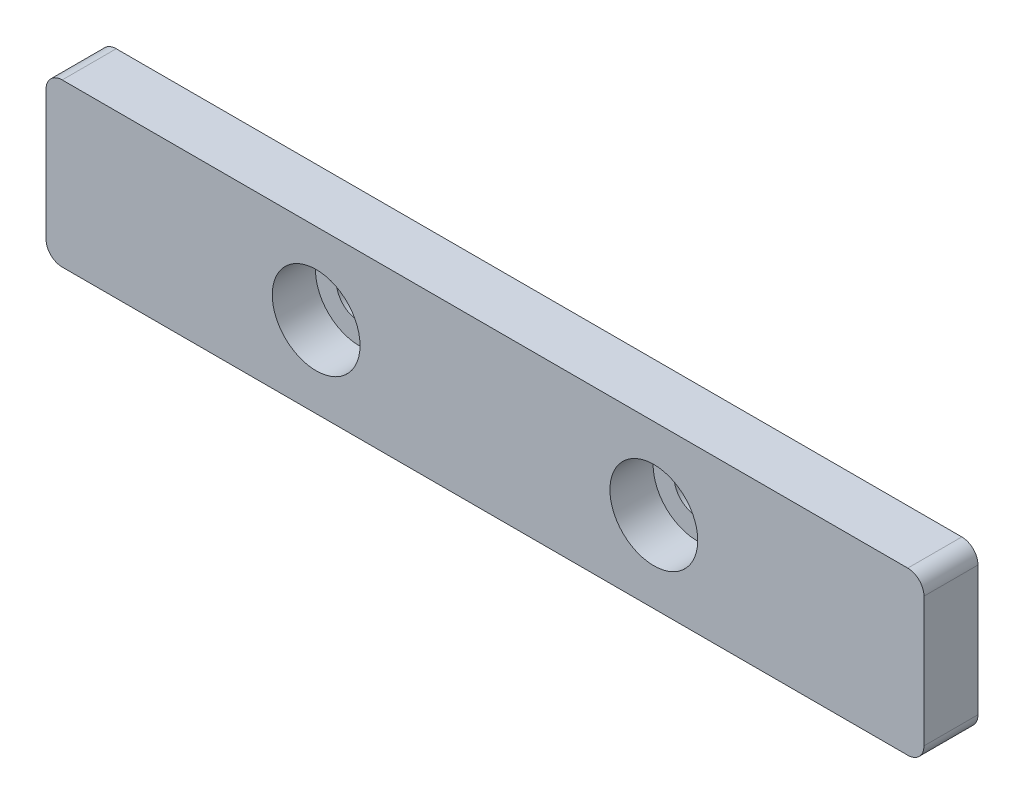
ISO-10303-21;
HEADER;
FILE_DESCRIPTION(('STEP AP214'),'2;1');
FILE_NAME('part.step','',(''),(''),'','','');
FILE_SCHEMA(('AUTOMOTIVE_DESIGN { 1 0 10303 214 1 1 1 1 }'));
ENDSEC;
DATA;
#1=APPLICATION_CONTEXT('core data for automotive mechanical design processes');
#2=APPLICATION_PROTOCOL_DEFINITION('international standard','automotive_design',2000,#1);
#3=PRODUCT_CONTEXT('',#1,'mechanical');
#4=PRODUCT('Part','Part','',(#3));
#5=PRODUCT_RELATED_PRODUCT_CATEGORY('part','',(#4));
#6=PRODUCT_DEFINITION_FORMATION('','',#4);
#7=PRODUCT_DEFINITION_CONTEXT('part definition',#1,'design');
#8=PRODUCT_DEFINITION('design','',#6,#7);
#9=PRODUCT_DEFINITION_SHAPE('','',#8);
#10=(LENGTH_UNIT() NAMED_UNIT(*) SI_UNIT(.MILLI.,.METRE.));
#11=(NAMED_UNIT(*) PLANE_ANGLE_UNIT() SI_UNIT($,.RADIAN.));
#12=(NAMED_UNIT(*) SI_UNIT($,.STERADIAN.) SOLID_ANGLE_UNIT());
#13=UNCERTAINTY_MEASURE_WITH_UNIT(LENGTH_MEASURE(1.E-05),#10,'distance_accuracy_value','');
#14=(GEOMETRIC_REPRESENTATION_CONTEXT(3) GLOBAL_UNCERTAINTY_ASSIGNED_CONTEXT((#13)) GLOBAL_UNIT_ASSIGNED_CONTEXT((#10,
#11,#12)) REPRESENTATION_CONTEXT('',''));
#15=CARTESIAN_POINT('',(0.,0.,0.));
#16=DIRECTION('',(0.,0.,1.));
#17=DIRECTION('',(1.,0.,0.));
#18=AXIS2_PLACEMENT_3D('',#15,#16,#17);
#19=CARTESIAN_POINT('',(46.7897452283095,11.8176884994758,18.));
#20=DIRECTION('',(0.,0.,1.));
#21=DIRECTION('',(1.,0.,0.));
#22=AXIS2_PLACEMENT_3D('',#19,#20,#21);
#23=CYLINDRICAL_SURFACE('',#22,1.7);
#24=CARTESIAN_POINT('',(46.7897452283095,11.8176884994758,18.));
#25=DIRECTION('',(0.,0.,1.));
#26=DIRECTION('',(1.,0.,0.));
#27=AXIS2_PLACEMENT_3D('',#24,#25,#26);
#28=CIRCLE('',#27,1.7);
#29=CARTESIAN_POINT('',(48.4897452283095,11.8176884994758,18.));
#30=VERTEX_POINT('',#29);
#31=EDGE_CURVE('E147',#30,#30,#28,.T.);
#32=ORIENTED_EDGE('',*,*,#31,.F.);
#33=EDGE_LOOP('',(#32));
#34=FACE_BOUND('',#33,.T.);
#35=CARTESIAN_POINT('',(46.7897452283095,11.8176884994758,18.8));
#36=DIRECTION('',(0.,0.,1.));
#37=DIRECTION('',(1.,0.,0.));
#38=AXIS2_PLACEMENT_3D('',#35,#36,#37);
#39=CIRCLE('',#38,1.7);
#40=CARTESIAN_POINT('',(48.4897452283095,11.8176884994758,18.8));
#41=VERTEX_POINT('',#40);
#42=EDGE_CURVE('E143',#41,#41,#39,.F.);
#43=ORIENTED_EDGE('',*,*,#42,.F.);
#44=EDGE_LOOP('',(#43));
#45=FACE_BOUND('',#44,.T.);
#46=ADVANCED_FACE('F40',(#34,#45),#23,.F.);
#47=CARTESIAN_POINT('',(21.7897452283095,11.8176884994758,18.));
#48=DIRECTION('',(0.,0.,1.));
#49=DIRECTION('',(1.,0.,0.));
#50=AXIS2_PLACEMENT_3D('',#47,#48,#49);
#51=CYLINDRICAL_SURFACE('',#50,1.7);
#52=CARTESIAN_POINT('',(21.7897452283095,11.8176884994758,18.));
#53=DIRECTION('',(0.,0.,1.));
#54=DIRECTION('',(1.,0.,0.));
#55=AXIS2_PLACEMENT_3D('',#52,#53,#54);
#56=CIRCLE('',#55,1.7);
#57=CARTESIAN_POINT('',(23.4897452283095,11.8176884994758,18.));
#58=VERTEX_POINT('',#57);
#59=EDGE_CURVE('E178',#58,#58,#56,.T.);
#60=ORIENTED_EDGE('',*,*,#59,.F.);
#61=EDGE_LOOP('',(#60));
#62=FACE_BOUND('',#61,.T.);
#63=CARTESIAN_POINT('',(21.7897452283095,11.8176884994758,18.8));
#64=DIRECTION('',(0.,0.,1.));
#65=DIRECTION('',(1.,0.,0.));
#66=AXIS2_PLACEMENT_3D('',#63,#64,#65);
#67=CIRCLE('',#66,1.7);
#68=CARTESIAN_POINT('',(23.4897452283095,11.8176884994758,18.8));
#69=VERTEX_POINT('',#68);
#70=EDGE_CURVE('E140',#69,#69,#67,.F.);
#71=ORIENTED_EDGE('',*,*,#70,.F.);
#72=EDGE_LOOP('',(#71));
#73=FACE_BOUND('',#72,.T.);
#74=ADVANCED_FACE('F231',(#62,#73),#51,.F.);
#75=CARTESIAN_POINT('',(1.78974522830947,17.8176884994758,22.));
#76=DIRECTION('',(1.,0.,0.));
#77=DIRECTION('',(0.,0.,-1.));
#78=AXIS2_PLACEMENT_3D('',#75,#76,#77);
#79=PLANE('',#78);
#80=DIRECTION('',(0.,-1.,0.));
#81=VECTOR('',#80,1.);
#82=CARTESIAN_POINT('',(1.78974522830947,17.8176884994758,18.));
#83=LINE('',#82,#81);
#84=CARTESIAN_POINT('',(1.78974522830947,16.6176884994758,18.));
#85=VERTEX_POINT('',#84);
#86=CARTESIAN_POINT('',(1.78974522830947,7.01768849947579,18.));
#87=VERTEX_POINT('',#86);
#88=EDGE_CURVE('E136',#85,#87,#83,.T.);
#89=ORIENTED_EDGE('',*,*,#88,.T.);
#90=DIRECTION('',(0.,0.,-1.));
#91=VECTOR('',#90,1.);
#92=CARTESIAN_POINT('',(1.78974522830947,7.01768849947579,22.));
#93=LINE('',#92,#91);
#94=CARTESIAN_POINT('',(1.78974522830947,7.01768849947579,22.));
#95=VERTEX_POINT('',#94);
#96=EDGE_CURVE('E11',#87,#95,#93,.F.);
#97=ORIENTED_EDGE('',*,*,#96,.T.);
#98=DIRECTION('',(0.,-1.,0.));
#99=VECTOR('',#98,1.);
#100=CARTESIAN_POINT('',(1.78974522830947,17.8176884994758,22.));
#101=LINE('',#100,#99);
#102=CARTESIAN_POINT('',(1.78974522830947,16.6176884994758,22.));
#103=VERTEX_POINT('',#102);
#104=EDGE_CURVE('E134',#103,#95,#101,.T.);
#105=ORIENTED_EDGE('',*,*,#104,.F.);
#106=DIRECTION('',(0.,0.,-1.));
#107=VECTOR('',#106,1.);
#108=CARTESIAN_POINT('',(1.78974522830947,16.6176884994758,22.));
#109=LINE('',#108,#107);
#110=EDGE_CURVE('E48',#103,#85,#109,.T.);
#111=ORIENTED_EDGE('',*,*,#110,.T.);
#112=EDGE_LOOP('',(#89,#97,#105,#111));
#113=FACE_BOUND('',#112,.T.);
#114=ADVANCED_FACE('F173',(#113),#79,.F.);
#115=CARTESIAN_POINT('',(1.78974522830947,5.81768849947579,22.));
#116=DIRECTION('',(0.,1.,0.));
#117=DIRECTION('',(0.,0.,1.));
#118=AXIS2_PLACEMENT_3D('',#115,#116,#117);
#119=PLANE('',#118);
#120=DIRECTION('',(1.,0.,0.));
#121=VECTOR('',#120,1.);
#122=CARTESIAN_POINT('',(1.78974522830947,5.81768849947579,18.));
#123=LINE('',#122,#121);
#124=CARTESIAN_POINT('',(2.98974522830947,5.81768849947579,18.));
#125=VERTEX_POINT('',#124);
#126=CARTESIAN_POINT('',(65.5897452283095,5.81768849947579,18.));
#127=VERTEX_POINT('',#126);
#128=EDGE_CURVE('E132',#125,#127,#123,.T.);
#129=ORIENTED_EDGE('',*,*,#128,.T.);
#130=DIRECTION('',(0.,0.,-1.));
#131=VECTOR('',#130,1.);
#132=CARTESIAN_POINT('',(65.5897452283095,5.81768849947579,22.));
#133=LINE('',#132,#131);
#134=CARTESIAN_POINT('',(65.5897452283095,5.81768849947579,22.));
#135=VERTEX_POINT('',#134);
#136=EDGE_CURVE('E111',#127,#135,#133,.F.);
#137=ORIENTED_EDGE('',*,*,#136,.T.);
#138=DIRECTION('',(1.,0.,0.));
#139=VECTOR('',#138,1.);
#140=CARTESIAN_POINT('',(1.78974522830947,5.81768849947579,22.));
#141=LINE('',#140,#139);
#142=CARTESIAN_POINT('',(2.98974522830947,5.81768849947579,22.));
#143=VERTEX_POINT('',#142);
#144=EDGE_CURVE('E184',#143,#135,#141,.T.);
#145=ORIENTED_EDGE('',*,*,#144,.F.);
#146=DIRECTION('',(0.,0.,-1.));
#147=VECTOR('',#146,1.);
#148=CARTESIAN_POINT('',(2.98974522830947,5.81768849947579,22.));
#149=LINE('',#148,#147);
#150=EDGE_CURVE('E116',#143,#125,#149,.T.);
#151=ORIENTED_EDGE('',*,*,#150,.T.);
#152=EDGE_LOOP('',(#129,#137,#145,#151));
#153=FACE_BOUND('',#152,.T.);
#154=ADVANCED_FACE('F222',(#153),#119,.F.);
#155=CARTESIAN_POINT('',(66.7897452283095,17.8176884994758,22.));
#156=DIRECTION('',(-1.,0.,0.));
#157=DIRECTION('',(0.,0.,1.));
#158=AXIS2_PLACEMENT_3D('',#155,#156,#157);
#159=PLANE('',#158);
#160=DIRECTION('',(0.,1.,0.));
#161=VECTOR('',#160,1.);
#162=CARTESIAN_POINT('',(66.7897452283095,17.8176884994758,22.));
#163=LINE('',#162,#161);
#164=CARTESIAN_POINT('',(66.7897452283095,7.01768849947579,22.));
#165=VERTEX_POINT('',#164);
#166=CARTESIAN_POINT('',(66.7897452283095,16.6176884994758,22.));
#167=VERTEX_POINT('',#166);
#168=EDGE_CURVE('E125',#165,#167,#163,.T.);
#169=ORIENTED_EDGE('',*,*,#168,.F.);
#170=DIRECTION('',(0.,0.,-1.));
#171=VECTOR('',#170,1.);
#172=CARTESIAN_POINT('',(66.7897452283095,7.01768849947579,22.));
#173=LINE('',#172,#171);
#174=CARTESIAN_POINT('',(66.7897452283095,7.01768849947579,18.));
#175=VERTEX_POINT('',#174);
#176=EDGE_CURVE('E110',#165,#175,#173,.T.);
#177=ORIENTED_EDGE('',*,*,#176,.T.);
#178=DIRECTION('',(0.,1.,0.));
#179=VECTOR('',#178,1.);
#180=CARTESIAN_POINT('',(66.7897452283095,17.8176884994758,18.));
#181=LINE('',#180,#179);
#182=CARTESIAN_POINT('',(66.7897452283095,16.6176884994758,18.));
#183=VERTEX_POINT('',#182);
#184=EDGE_CURVE('E123',#175,#183,#181,.T.);
#185=ORIENTED_EDGE('',*,*,#184,.T.);
#186=DIRECTION('',(0.,0.,-1.));
#187=VECTOR('',#186,1.);
#188=CARTESIAN_POINT('',(66.7897452283095,16.6176884994758,22.));
#189=LINE('',#188,#187);
#190=EDGE_CURVE('E127',#183,#167,#189,.F.);
#191=ORIENTED_EDGE('',*,*,#190,.T.);
#192=EDGE_LOOP('',(#169,#177,#185,#191));
#193=FACE_BOUND('',#192,.T.);
#194=ADVANCED_FACE('F122',(#193),#159,.F.);
#195=CARTESIAN_POINT('',(1.78974522830947,17.8176884994758,22.));
#196=DIRECTION('',(0.,-1.,0.));
#197=DIRECTION('',(0.,0.,-1.));
#198=AXIS2_PLACEMENT_3D('',#195,#196,#197);
#199=PLANE('',#198);
#200=DIRECTION('',(-1.,0.,0.));
#201=VECTOR('',#200,1.);
#202=CARTESIAN_POINT('',(1.78974522830947,17.8176884994758,22.));
#203=LINE('',#202,#201);
#204=CARTESIAN_POINT('',(65.5897452283095,17.8176884994758,22.));
#205=VERTEX_POINT('',#204);
#206=CARTESIAN_POINT('',(2.98974522830947,17.8176884994758,22.));
#207=VERTEX_POINT('',#206);
#208=EDGE_CURVE('E148',#205,#207,#203,.T.);
#209=ORIENTED_EDGE('',*,*,#208,.F.);
#210=DIRECTION('',(0.,0.,-1.));
#211=VECTOR('',#210,1.);
#212=CARTESIAN_POINT('',(65.5897452283095,17.8176884994758,22.));
#213=LINE('',#212,#211);
#214=CARTESIAN_POINT('',(65.5897452283095,17.8176884994758,18.));
#215=VERTEX_POINT('',#214);
#216=EDGE_CURVE('E165',#205,#215,#213,.T.);
#217=ORIENTED_EDGE('',*,*,#216,.T.);
#218=DIRECTION('',(-1.,0.,0.));
#219=VECTOR('',#218,1.);
#220=CARTESIAN_POINT('',(1.78974522830947,17.8176884994758,18.));
#221=LINE('',#220,#219);
#222=CARTESIAN_POINT('',(2.98974522830947,17.8176884994758,18.));
#223=VERTEX_POINT('',#222);
#224=EDGE_CURVE('E131',#215,#223,#221,.T.);
#225=ORIENTED_EDGE('',*,*,#224,.T.);
#226=DIRECTION('',(0.,0.,-1.));
#227=VECTOR('',#226,1.);
#228=CARTESIAN_POINT('',(2.98974522830947,17.8176884994758,22.));
#229=LINE('',#228,#227);
#230=EDGE_CURVE('E55',#223,#207,#229,.F.);
#231=ORIENTED_EDGE('',*,*,#230,.T.);
#232=EDGE_LOOP('',(#209,#217,#225,#231));
#233=FACE_BOUND('',#232,.T.);
#234=ADVANCED_FACE('F215',(#233),#199,.F.);
#235=CARTESIAN_POINT('',(0.,0.,22.));
#236=DIRECTION('',(0.,0.,1.));
#237=DIRECTION('',(1.,0.,0.));
#238=AXIS2_PLACEMENT_3D('',#235,#236,#237);
#239=PLANE('',#238);
#240=CARTESIAN_POINT('',(21.7897452283095,11.8176884994758,22.));
#241=DIRECTION('',(0.,0.,1.));
#242=DIRECTION('',(1.,0.,0.));
#243=AXIS2_PLACEMENT_3D('',#240,#241,#242);
#244=CIRCLE('',#243,3.25);
#245=CARTESIAN_POINT('',(25.0397452283095,11.8176884994758,22.));
#246=VERTEX_POINT('',#245);
#247=EDGE_CURVE('E196',#246,#246,#244,.T.);
#248=ORIENTED_EDGE('',*,*,#247,.F.);
#249=EDGE_LOOP('',(#248));
#250=FACE_BOUND('',#249,.T.);
#251=CARTESIAN_POINT('',(46.7897452283095,11.8176884994758,22.));
#252=DIRECTION('',(0.,0.,1.));
#253=DIRECTION('',(1.,0.,0.));
#254=AXIS2_PLACEMENT_3D('',#251,#252,#253);
#255=CIRCLE('',#254,3.25);
#256=CARTESIAN_POINT('',(50.0397452283095,11.8176884994758,22.));
#257=VERTEX_POINT('',#256);
#258=EDGE_CURVE('E193',#257,#257,#255,.T.);
#259=ORIENTED_EDGE('',*,*,#258,.F.);
#260=EDGE_LOOP('',(#259));
#261=FACE_BOUND('',#260,.T.);
#262=ORIENTED_EDGE('',*,*,#144,.T.);
#263=CARTESIAN_POINT('',(65.5897452283095,7.01768849947579,22.));
#264=DIRECTION('',(0.,0.,1.));
#265=DIRECTION('',(1.,0.,0.));
#266=AXIS2_PLACEMENT_3D('',#263,#264,#265);
#267=CIRCLE('',#266,1.2);
#268=EDGE_CURVE('E162',#135,#165,#267,.T.);
#269=ORIENTED_EDGE('',*,*,#268,.T.);
#270=ORIENTED_EDGE('',*,*,#168,.T.);
#271=CARTESIAN_POINT('',(65.5897452283095,16.6176884994758,22.));
#272=DIRECTION('',(0.,0.,1.));
#273=DIRECTION('',(1.,0.,0.));
#274=AXIS2_PLACEMENT_3D('',#271,#272,#273);
#275=CIRCLE('',#274,1.2);
#276=EDGE_CURVE('E62',#167,#205,#275,.T.);
#277=ORIENTED_EDGE('',*,*,#276,.T.);
#278=ORIENTED_EDGE('',*,*,#208,.T.);
#279=CARTESIAN_POINT('',(2.98974522830947,16.6176884994758,22.));
#280=DIRECTION('',(0.,0.,1.));
#281=DIRECTION('',(1.,0.,0.));
#282=AXIS2_PLACEMENT_3D('',#279,#280,#281);
#283=CIRCLE('',#282,1.2);
#284=EDGE_CURVE('E157',#207,#103,#283,.T.);
#285=ORIENTED_EDGE('',*,*,#284,.T.);
#286=ORIENTED_EDGE('',*,*,#104,.T.);
#287=CARTESIAN_POINT('',(2.98974522830947,7.01768849947579,22.));
#288=DIRECTION('',(0.,0.,1.));
#289=DIRECTION('',(1.,0.,0.));
#290=AXIS2_PLACEMENT_3D('',#287,#288,#289);
#291=CIRCLE('',#290,1.2);
#292=EDGE_CURVE('E159',#95,#143,#291,.T.);
#293=ORIENTED_EDGE('',*,*,#292,.T.);
#294=EDGE_LOOP('',(#262,#269,#270,#277,#278,#285,#286,#293));
#295=FACE_BOUND('',#294,.T.);
#296=ADVANCED_FACE('F212',(#250,#261,#295),#239,.T.);
#297=CARTESIAN_POINT('',(0.,0.,18.));
#298=DIRECTION('',(0.,0.,1.));
#299=DIRECTION('',(1.,0.,0.));
#300=AXIS2_PLACEMENT_3D('',#297,#298,#299);
#301=PLANE('',#300);
#302=ORIENTED_EDGE('',*,*,#59,.T.);
#303=EDGE_LOOP('',(#302));
#304=FACE_BOUND('',#303,.T.);
#305=ORIENTED_EDGE('',*,*,#31,.T.);
#306=EDGE_LOOP('',(#305));
#307=FACE_BOUND('',#306,.T.);
#308=ORIENTED_EDGE('',*,*,#184,.F.);
#309=CARTESIAN_POINT('',(65.5897452283095,7.01768849947579,18.));
#310=DIRECTION('',(0.,0.,1.));
#311=DIRECTION('',(1.,0.,0.));
#312=AXIS2_PLACEMENT_3D('',#309,#310,#311);
#313=CIRCLE('',#312,1.2);
#314=EDGE_CURVE('E106',#175,#127,#313,.F.);
#315=ORIENTED_EDGE('',*,*,#314,.T.);
#316=ORIENTED_EDGE('',*,*,#128,.F.);
#317=CARTESIAN_POINT('',(2.98974522830947,7.01768849947579,18.));
#318=DIRECTION('',(0.,0.,1.));
#319=DIRECTION('',(1.,0.,0.));
#320=AXIS2_PLACEMENT_3D('',#317,#318,#319);
#321=CIRCLE('',#320,1.2);
#322=EDGE_CURVE('E151',#125,#87,#321,.F.);
#323=ORIENTED_EDGE('',*,*,#322,.T.);
#324=ORIENTED_EDGE('',*,*,#88,.F.);
#325=CARTESIAN_POINT('',(2.98974522830947,16.6176884994758,18.));
#326=DIRECTION('',(0.,0.,1.));
#327=DIRECTION('',(1.,0.,0.));
#328=AXIS2_PLACEMENT_3D('',#325,#326,#327);
#329=CIRCLE('',#328,1.2);
#330=EDGE_CURVE('E126',#85,#223,#329,.F.);
#331=ORIENTED_EDGE('',*,*,#330,.T.);
#332=ORIENTED_EDGE('',*,*,#224,.F.);
#333=CARTESIAN_POINT('',(65.5897452283095,16.6176884994758,18.));
#334=DIRECTION('',(0.,0.,1.));
#335=DIRECTION('',(1.,0.,0.));
#336=AXIS2_PLACEMENT_3D('',#333,#334,#335);
#337=CIRCLE('',#336,1.2);
#338=EDGE_CURVE('E117',#215,#183,#337,.F.);
#339=ORIENTED_EDGE('',*,*,#338,.T.);
#340=EDGE_LOOP('',(#308,#315,#316,#323,#324,#331,#332,#339));
#341=FACE_BOUND('',#340,.T.);
#342=ADVANCED_FACE('F129',(#304,#307,#341),#301,.F.);
#343=CARTESIAN_POINT('',(21.7897452283095,11.8176884994758,18.8));
#344=DIRECTION('',(0.,0.,1.));
#345=DIRECTION('',(1.,0.,0.));
#346=AXIS2_PLACEMENT_3D('',#343,#344,#345);
#347=PLANE('',#346);
#348=CARTESIAN_POINT('',(21.7897452283095,11.8176884994758,18.8));
#349=DIRECTION('',(0.,0.,1.));
#350=DIRECTION('',(1.,0.,0.));
#351=AXIS2_PLACEMENT_3D('',#348,#349,#350);
#352=CIRCLE('',#351,3.25);
#353=CARTESIAN_POINT('',(25.0397452283095,11.8176884994758,18.8));
#354=VERTEX_POINT('',#353);
#355=EDGE_CURVE('E144',#354,#354,#352,.T.);
#356=ORIENTED_EDGE('',*,*,#355,.T.);
#357=EDGE_LOOP('',(#356));
#358=FACE_BOUND('',#357,.T.);
#359=ORIENTED_EDGE('',*,*,#70,.T.);
#360=EDGE_LOOP('',(#359));
#361=FACE_BOUND('',#360,.T.);
#362=ADVANCED_FACE('F202',(#358,#361),#347,.T.);
#363=CARTESIAN_POINT('',(21.7897452283095,11.8176884994758,18.8));
#364=DIRECTION('',(0.,0.,1.));
#365=DIRECTION('',(1.,0.,0.));
#366=AXIS2_PLACEMENT_3D('',#363,#364,#365);
#367=CYLINDRICAL_SURFACE('',#366,3.25);
#368=ORIENTED_EDGE('',*,*,#355,.F.);
#369=EDGE_LOOP('',(#368));
#370=FACE_BOUND('',#369,.T.);
#371=ORIENTED_EDGE('',*,*,#247,.T.);
#372=EDGE_LOOP('',(#371));
#373=FACE_BOUND('',#372,.T.);
#374=ADVANCED_FACE('F205',(#370,#373),#367,.F.);
#375=CARTESIAN_POINT('',(46.7897452283095,11.8176884994758,18.8));
#376=DIRECTION('',(0.,0.,1.));
#377=DIRECTION('',(1.,0.,0.));
#378=AXIS2_PLACEMENT_3D('',#375,#376,#377);
#379=PLANE('',#378);
#380=CARTESIAN_POINT('',(46.7897452283095,11.8176884994758,18.8));
#381=DIRECTION('',(0.,0.,1.));
#382=DIRECTION('',(1.,0.,0.));
#383=AXIS2_PLACEMENT_3D('',#380,#381,#382);
#384=CIRCLE('',#383,3.25);
#385=CARTESIAN_POINT('',(50.0397452283095,11.8176884994758,18.8));
#386=VERTEX_POINT('',#385);
#387=EDGE_CURVE('E190',#386,#386,#384,.T.);
#388=ORIENTED_EDGE('',*,*,#387,.T.);
#389=EDGE_LOOP('',(#388));
#390=FACE_BOUND('',#389,.T.);
#391=ORIENTED_EDGE('',*,*,#42,.T.);
#392=EDGE_LOOP('',(#391));
#393=FACE_BOUND('',#392,.T.);
#394=ADVANCED_FACE('F208',(#390,#393),#379,.T.);
#395=CARTESIAN_POINT('',(46.7897452283095,11.8176884994758,18.8));
#396=DIRECTION('',(0.,0.,1.));
#397=DIRECTION('',(1.,0.,0.));
#398=AXIS2_PLACEMENT_3D('',#395,#396,#397);
#399=CYLINDRICAL_SURFACE('',#398,3.25);
#400=ORIENTED_EDGE('',*,*,#387,.F.);
#401=EDGE_LOOP('',(#400));
#402=FACE_BOUND('',#401,.T.);
#403=ORIENTED_EDGE('',*,*,#258,.T.);
#404=EDGE_LOOP('',(#403));
#405=FACE_BOUND('',#404,.T.);
#406=ADVANCED_FACE('F256',(#402,#405),#399,.F.);
#407=CARTESIAN_POINT('',(65.5897452283095,7.01768849947579,22.));
#408=DIRECTION('',(0.,0.,-1.));
#409=DIRECTION('',(-1.,0.,0.));
#410=AXIS2_PLACEMENT_3D('',#407,#408,#409);
#411=CYLINDRICAL_SURFACE('',#410,1.2);
#412=ORIENTED_EDGE('',*,*,#268,.F.);
#413=ORIENTED_EDGE('',*,*,#136,.F.);
#414=ORIENTED_EDGE('',*,*,#314,.F.);
#415=ORIENTED_EDGE('',*,*,#176,.F.);
#416=EDGE_LOOP('',(#412,#413,#414,#415));
#417=FACE_BOUND('',#416,.T.);
#418=ADVANCED_FACE('F109',(#417),#411,.T.);
#419=CARTESIAN_POINT('',(65.5897452283095,16.6176884994758,22.));
#420=DIRECTION('',(0.,0.,-1.));
#421=DIRECTION('',(-1.,0.,0.));
#422=AXIS2_PLACEMENT_3D('',#419,#420,#421);
#423=CYLINDRICAL_SURFACE('',#422,1.2);
#424=ORIENTED_EDGE('',*,*,#276,.F.);
#425=ORIENTED_EDGE('',*,*,#190,.F.);
#426=ORIENTED_EDGE('',*,*,#338,.F.);
#427=ORIENTED_EDGE('',*,*,#216,.F.);
#428=EDGE_LOOP('',(#424,#425,#426,#427));
#429=FACE_BOUND('',#428,.T.);
#430=ADVANCED_FACE('F229',(#429),#423,.T.);
#431=CARTESIAN_POINT('',(2.98974522830947,7.01768849947579,22.));
#432=DIRECTION('',(0.,0.,-1.));
#433=DIRECTION('',(-1.,0.,0.));
#434=AXIS2_PLACEMENT_3D('',#431,#432,#433);
#435=CYLINDRICAL_SURFACE('',#434,1.2);
#436=ORIENTED_EDGE('',*,*,#292,.F.);
#437=ORIENTED_EDGE('',*,*,#96,.F.);
#438=ORIENTED_EDGE('',*,*,#322,.F.);
#439=ORIENTED_EDGE('',*,*,#150,.F.);
#440=EDGE_LOOP('',(#436,#437,#438,#439));
#441=FACE_BOUND('',#440,.T.);
#442=ADVANCED_FACE('F224',(#441),#435,.T.);
#443=CARTESIAN_POINT('',(2.98974522830947,16.6176884994758,22.));
#444=DIRECTION('',(0.,0.,-1.));
#445=DIRECTION('',(-1.,0.,0.));
#446=AXIS2_PLACEMENT_3D('',#443,#444,#445);
#447=CYLINDRICAL_SURFACE('',#446,1.2);
#448=ORIENTED_EDGE('',*,*,#284,.F.);
#449=ORIENTED_EDGE('',*,*,#230,.F.);
#450=ORIENTED_EDGE('',*,*,#330,.F.);
#451=ORIENTED_EDGE('',*,*,#110,.F.);
#452=EDGE_LOOP('',(#448,#449,#450,#451));
#453=FACE_BOUND('',#452,.T.);
#454=ADVANCED_FACE('F42',(#453),#447,.T.);
#455=CLOSED_SHELL('',(#46,#74,#114,#154,#194,#234,#296,#342,#362,#374,#394,#406,#418,#430,#442,#454));
#456=MANIFOLD_SOLID_BREP('B2',#455);
#457=ADVANCED_BREP_SHAPE_REPRESENTATION('',(#18,#456),#14);
#458=SHAPE_DEFINITION_REPRESENTATION(#9,#457);
ENDSEC;
END-ISO-10303-21;
